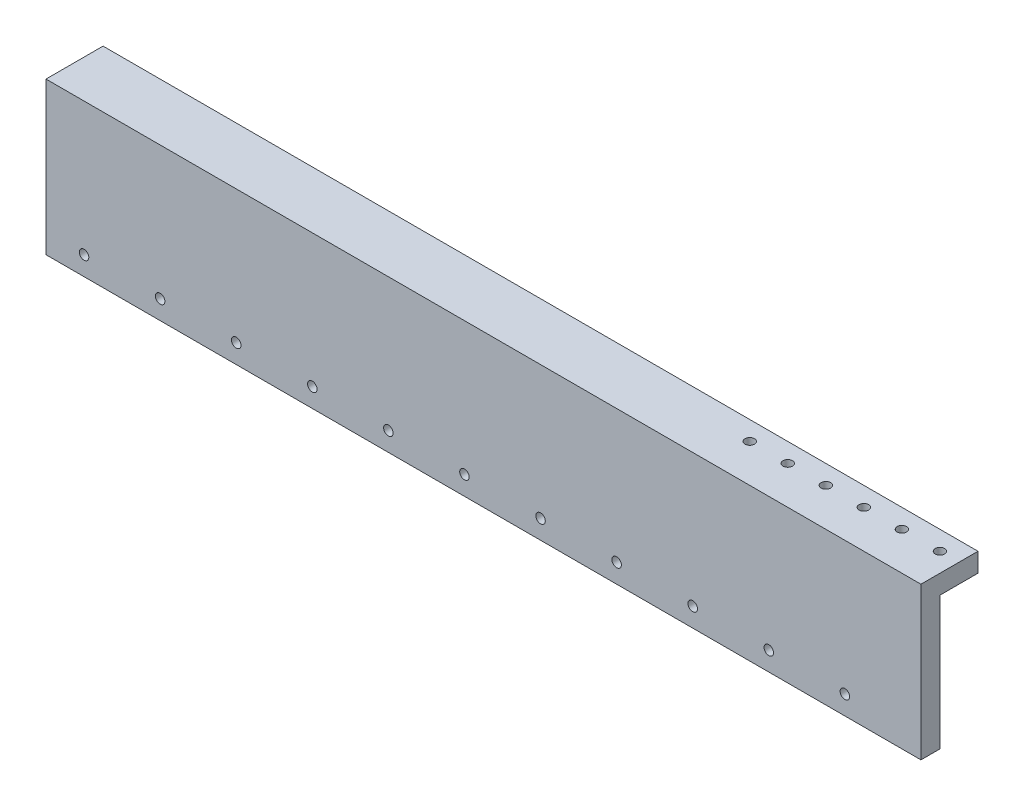
ISO-10303-21;
HEADER;
FILE_DESCRIPTION(('STEP AP214'),'2;1');
FILE_NAME('part.step','',(''),(''),'','','');
FILE_SCHEMA(('AUTOMOTIVE_DESIGN { 1 0 10303 214 1 1 1 1 }'));
ENDSEC;
DATA;
#1=APPLICATION_CONTEXT('core data for automotive mechanical design processes');
#2=APPLICATION_PROTOCOL_DEFINITION('international standard','automotive_design',2000,#1);
#3=PRODUCT_CONTEXT('',#1,'mechanical');
#4=PRODUCT('Part','Part','',(#3));
#5=PRODUCT_RELATED_PRODUCT_CATEGORY('part','',(#4));
#6=PRODUCT_DEFINITION_FORMATION('','',#4);
#7=PRODUCT_DEFINITION_CONTEXT('part definition',#1,'design');
#8=PRODUCT_DEFINITION('design','',#6,#7);
#9=PRODUCT_DEFINITION_SHAPE('','',#8);
#10=(LENGTH_UNIT() NAMED_UNIT(*) SI_UNIT(.MILLI.,.METRE.));
#11=(NAMED_UNIT(*) PLANE_ANGLE_UNIT() SI_UNIT($,.RADIAN.));
#12=(NAMED_UNIT(*) SI_UNIT($,.STERADIAN.) SOLID_ANGLE_UNIT());
#13=UNCERTAINTY_MEASURE_WITH_UNIT(LENGTH_MEASURE(1.E-05),#10,'distance_accuracy_value','');
#14=(GEOMETRIC_REPRESENTATION_CONTEXT(3) GLOBAL_UNCERTAINTY_ASSIGNED_CONTEXT((#13)) GLOBAL_UNIT_ASSIGNED_CONTEXT((#10,
#11,#12)) REPRESENTATION_CONTEXT('',''));
#15=CARTESIAN_POINT('',(0.,0.,0.));
#16=DIRECTION('',(0.,0.,1.));
#17=DIRECTION('',(1.,0.,0.));
#18=AXIS2_PLACEMENT_3D('',#15,#16,#17);
#19=CARTESIAN_POINT('',(0.,0.,-5.));
#20=DIRECTION('',(0.,0.,1.));
#21=DIRECTION('',(-1.,0.,0.));
#22=AXIS2_PLACEMENT_3D('',#19,#20,#21);
#23=PLANE('',#22);
#24=CARTESIAN_POINT('',(95.,-15.,-5.));
#25=DIRECTION('',(0.,0.,1.));
#26=DIRECTION('',(1.,0.,0.));
#27=AXIS2_PLACEMENT_3D('',#24,#25,#26);
#28=CIRCLE('',#27,1.25);
#29=CARTESIAN_POINT('',(96.25,-15.,-5.));
#30=VERTEX_POINT('',#29);
#31=EDGE_CURVE('E181',#30,#30,#28,.T.);
#32=ORIENTED_EDGE('',*,*,#31,.T.);
#33=EDGE_LOOP('',(#32));
#34=FACE_BOUND('',#33,.T.);
#35=CARTESIAN_POINT('',(75.,-15.,-5.));
#36=DIRECTION('',(0.,0.,1.));
#37=DIRECTION('',(1.,0.,0.));
#38=AXIS2_PLACEMENT_3D('',#35,#36,#37);
#39=CIRCLE('',#38,1.25);
#40=CARTESIAN_POINT('',(76.25,-15.,-5.));
#41=VERTEX_POINT('',#40);
#42=EDGE_CURVE('E175',#41,#41,#39,.T.);
#43=ORIENTED_EDGE('',*,*,#42,.T.);
#44=EDGE_LOOP('',(#43));
#45=FACE_BOUND('',#44,.T.);
#46=CARTESIAN_POINT('',(55.,-15.,-5.));
#47=DIRECTION('',(0.,0.,1.));
#48=DIRECTION('',(1.,0.,0.));
#49=AXIS2_PLACEMENT_3D('',#46,#47,#48);
#50=CIRCLE('',#49,1.25);
#51=CARTESIAN_POINT('',(56.25,-15.,-5.));
#52=VERTEX_POINT('',#51);
#53=EDGE_CURVE('E169',#52,#52,#50,.T.);
#54=ORIENTED_EDGE('',*,*,#53,.T.);
#55=EDGE_LOOP('',(#54));
#56=FACE_BOUND('',#55,.T.);
#57=CARTESIAN_POINT('',(35.,-15.,-5.));
#58=DIRECTION('',(0.,0.,1.));
#59=DIRECTION('',(1.,0.,0.));
#60=AXIS2_PLACEMENT_3D('',#57,#58,#59);
#61=CIRCLE('',#60,1.25);
#62=CARTESIAN_POINT('',(36.25,-15.,-5.));
#63=VERTEX_POINT('',#62);
#64=EDGE_CURVE('E163',#63,#63,#61,.T.);
#65=ORIENTED_EDGE('',*,*,#64,.T.);
#66=EDGE_LOOP('',(#65));
#67=FACE_BOUND('',#66,.T.);
#68=CARTESIAN_POINT('',(15.,-15.,-5.));
#69=DIRECTION('',(0.,0.,1.));
#70=DIRECTION('',(1.,0.,0.));
#71=AXIS2_PLACEMENT_3D('',#68,#69,#70);
#72=CIRCLE('',#71,1.25);
#73=CARTESIAN_POINT('',(16.25,-15.,-5.));
#74=VERTEX_POINT('',#73);
#75=EDGE_CURVE('E157',#74,#74,#72,.T.);
#76=ORIENTED_EDGE('',*,*,#75,.T.);
#77=EDGE_LOOP('',(#76));
#78=FACE_BOUND('',#77,.T.);
#79=CARTESIAN_POINT('',(-4.99999999999999,-15.,-5.));
#80=DIRECTION('',(0.,0.,1.));
#81=DIRECTION('',(1.,0.,0.));
#82=AXIS2_PLACEMENT_3D('',#79,#80,#81);
#83=CIRCLE('',#82,1.25);
#84=CARTESIAN_POINT('',(-3.74999999999999,-15.,-5.));
#85=VERTEX_POINT('',#84);
#86=EDGE_CURVE('E151',#85,#85,#83,.T.);
#87=ORIENTED_EDGE('',*,*,#86,.T.);
#88=EDGE_LOOP('',(#87));
#89=FACE_BOUND('',#88,.T.);
#90=CARTESIAN_POINT('',(-25.,-15.,-5.));
#91=DIRECTION('',(0.,0.,1.));
#92=DIRECTION('',(1.,0.,0.));
#93=AXIS2_PLACEMENT_3D('',#90,#91,#92);
#94=CIRCLE('',#93,1.25);
#95=CARTESIAN_POINT('',(-23.75,-15.,-5.));
#96=VERTEX_POINT('',#95);
#97=EDGE_CURVE('E145',#96,#96,#94,.T.);
#98=ORIENTED_EDGE('',*,*,#97,.T.);
#99=EDGE_LOOP('',(#98));
#100=FACE_BOUND('',#99,.T.);
#101=CARTESIAN_POINT('',(-45.,-15.,-5.));
#102=DIRECTION('',(0.,0.,1.));
#103=DIRECTION('',(1.,0.,0.));
#104=AXIS2_PLACEMENT_3D('',#101,#102,#103);
#105=CIRCLE('',#104,1.25);
#106=CARTESIAN_POINT('',(-43.75,-15.,-5.));
#107=VERTEX_POINT('',#106);
#108=EDGE_CURVE('E139',#107,#107,#105,.T.);
#109=ORIENTED_EDGE('',*,*,#108,.T.);
#110=EDGE_LOOP('',(#109));
#111=FACE_BOUND('',#110,.T.);
#112=CARTESIAN_POINT('',(-65.,-15.,-5.));
#113=DIRECTION('',(0.,0.,1.));
#114=DIRECTION('',(1.,0.,0.));
#115=AXIS2_PLACEMENT_3D('',#112,#113,#114);
#116=CIRCLE('',#115,1.25000000000001);
#117=CARTESIAN_POINT('',(-63.75,-15.,-5.));
#118=VERTEX_POINT('',#117);
#119=EDGE_CURVE('E133',#118,#118,#116,.T.);
#120=ORIENTED_EDGE('',*,*,#119,.T.);
#121=EDGE_LOOP('',(#120));
#122=FACE_BOUND('',#121,.T.);
#123=CARTESIAN_POINT('',(-85.,-15.,-5.));
#124=DIRECTION('',(0.,0.,1.));
#125=DIRECTION('',(1.,0.,0.));
#126=AXIS2_PLACEMENT_3D('',#123,#124,#125);
#127=CIRCLE('',#126,1.25);
#128=CARTESIAN_POINT('',(-83.75,-15.,-5.));
#129=VERTEX_POINT('',#128);
#130=EDGE_CURVE('E128',#129,#129,#127,.T.);
#131=ORIENTED_EDGE('',*,*,#130,.T.);
#132=EDGE_LOOP('',(#131));
#133=FACE_BOUND('',#132,.T.);
#134=CARTESIAN_POINT('',(-105.,-15.,-5.));
#135=DIRECTION('',(0.,0.,1.));
#136=DIRECTION('',(1.,0.,0.));
#137=AXIS2_PLACEMENT_3D('',#134,#135,#136);
#138=CIRCLE('',#137,1.25);
#139=CARTESIAN_POINT('',(-103.75,-15.,-5.));
#140=VERTEX_POINT('',#139);
#141=EDGE_CURVE('E101',#140,#140,#138,.T.);
#142=ORIENTED_EDGE('',*,*,#141,.T.);
#143=EDGE_LOOP('',(#142));
#144=FACE_BOUND('',#143,.T.);
#145=DIRECTION('',(1.,0.,0.));
#146=VECTOR('',#145,1.);
#147=CARTESIAN_POINT('',(-115.,15.,-5.));
#148=LINE('',#147,#146);
#149=CARTESIAN_POINT('',(-115.,15.,-5.));
#150=VERTEX_POINT('',#149);
#151=CARTESIAN_POINT('',(115.,15.,-5.));
#152=VERTEX_POINT('',#151);
#153=EDGE_CURVE('E123',#150,#152,#148,.T.);
#154=ORIENTED_EDGE('',*,*,#153,.T.);
#155=DIRECTION('',(0.,1.,0.));
#156=VECTOR('',#155,1.);
#157=CARTESIAN_POINT('',(115.,-20.,-5.));
#158=LINE('',#157,#156);
#159=CARTESIAN_POINT('',(115.,-20.,-5.));
#160=VERTEX_POINT('',#159);
#161=EDGE_CURVE('E95',#160,#152,#158,.T.);
#162=ORIENTED_EDGE('',*,*,#161,.F.);
#163=DIRECTION('',(1.,0.,0.));
#164=VECTOR('',#163,1.);
#165=CARTESIAN_POINT('',(-115.,-20.,-5.));
#166=LINE('',#165,#164);
#167=CARTESIAN_POINT('',(-115.,-20.,-5.));
#168=VERTEX_POINT('',#167);
#169=EDGE_CURVE('E83',#168,#160,#166,.T.);
#170=ORIENTED_EDGE('',*,*,#169,.F.);
#171=DIRECTION('',(0.,-1.,0.));
#172=VECTOR('',#171,1.);
#173=CARTESIAN_POINT('',(-115.,-20.,-5.));
#174=LINE('',#173,#172);
#175=EDGE_CURVE('E118',#150,#168,#174,.T.);
#176=ORIENTED_EDGE('',*,*,#175,.F.);
#177=EDGE_LOOP('',(#154,#162,#170,#176));
#178=FACE_BOUND('',#177,.T.);
#179=ADVANCED_FACE('F37',(#34,#45,#56,#67,#78,#89,#100,#111,#122,#133,#144,#178),#23,.F.);
#180=CARTESIAN_POINT('',(0.,0.,0.));
#181=DIRECTION('',(0.,0.,1.));
#182=DIRECTION('',(-1.,0.,0.));
#183=AXIS2_PLACEMENT_3D('',#180,#181,#182);
#184=PLANE('',#183);
#185=CARTESIAN_POINT('',(75.,-15.,0.));
#186=DIRECTION('',(0.,0.,1.));
#187=DIRECTION('',(1.,0.,0.));
#188=AXIS2_PLACEMENT_3D('',#185,#186,#187);
#189=CIRCLE('',#188,1.25);
#190=CARTESIAN_POINT('',(76.25,-15.,0.));
#191=VERTEX_POINT('',#190);
#192=EDGE_CURVE('E178',#191,#191,#189,.T.);
#193=ORIENTED_EDGE('',*,*,#192,.F.);
#194=EDGE_LOOP('',(#193));
#195=FACE_BOUND('',#194,.T.);
#196=CARTESIAN_POINT('',(35.,-15.,0.));
#197=DIRECTION('',(0.,0.,1.));
#198=DIRECTION('',(1.,0.,0.));
#199=AXIS2_PLACEMENT_3D('',#196,#197,#198);
#200=CIRCLE('',#199,1.25);
#201=CARTESIAN_POINT('',(36.25,-15.,0.));
#202=VERTEX_POINT('',#201);
#203=EDGE_CURVE('E166',#202,#202,#200,.T.);
#204=ORIENTED_EDGE('',*,*,#203,.F.);
#205=EDGE_LOOP('',(#204));
#206=FACE_BOUND('',#205,.T.);
#207=CARTESIAN_POINT('',(-4.99999999999999,-15.,0.));
#208=DIRECTION('',(0.,0.,1.));
#209=DIRECTION('',(1.,0.,0.));
#210=AXIS2_PLACEMENT_3D('',#207,#208,#209);
#211=CIRCLE('',#210,1.25);
#212=CARTESIAN_POINT('',(-3.74999999999999,-15.,0.));
#213=VERTEX_POINT('',#212);
#214=EDGE_CURVE('E154',#213,#213,#211,.T.);
#215=ORIENTED_EDGE('',*,*,#214,.F.);
#216=EDGE_LOOP('',(#215));
#217=FACE_BOUND('',#216,.T.);
#218=CARTESIAN_POINT('',(-45.,-15.,0.));
#219=DIRECTION('',(0.,0.,1.));
#220=DIRECTION('',(1.,0.,0.));
#221=AXIS2_PLACEMENT_3D('',#218,#219,#220);
#222=CIRCLE('',#221,1.25);
#223=CARTESIAN_POINT('',(-43.75,-15.,0.));
#224=VERTEX_POINT('',#223);
#225=EDGE_CURVE('E142',#224,#224,#222,.T.);
#226=ORIENTED_EDGE('',*,*,#225,.F.);
#227=EDGE_LOOP('',(#226));
#228=FACE_BOUND('',#227,.T.);
#229=CARTESIAN_POINT('',(-85.,-15.,0.));
#230=DIRECTION('',(0.,0.,1.));
#231=DIRECTION('',(1.,0.,0.));
#232=AXIS2_PLACEMENT_3D('',#229,#230,#231);
#233=CIRCLE('',#232,1.25);
#234=CARTESIAN_POINT('',(-83.75,-15.,0.));
#235=VERTEX_POINT('',#234);
#236=EDGE_CURVE('E130',#235,#235,#233,.T.);
#237=ORIENTED_EDGE('',*,*,#236,.F.);
#238=EDGE_LOOP('',(#237));
#239=FACE_BOUND('',#238,.T.);
#240=DIRECTION('',(0.,1.,0.));
#241=VECTOR('',#240,1.);
#242=CARTESIAN_POINT('',(115.,-20.,0.));
#243=LINE('',#242,#241);
#244=CARTESIAN_POINT('',(115.,-20.,0.));
#245=VERTEX_POINT('',#244);
#246=CARTESIAN_POINT('',(115.,20.,0.));
#247=VERTEX_POINT('',#246);
#248=EDGE_CURVE('E92',#245,#247,#243,.T.);
#249=ORIENTED_EDGE('',*,*,#248,.T.);
#250=DIRECTION('',(-1.,0.,0.));
#251=VECTOR('',#250,1.);
#252=CARTESIAN_POINT('',(-115.,20.,0.));
#253=LINE('',#252,#251);
#254=CARTESIAN_POINT('',(-115.,20.,0.));
#255=VERTEX_POINT('',#254);
#256=EDGE_CURVE('E100',#247,#255,#253,.T.);
#257=ORIENTED_EDGE('',*,*,#256,.T.);
#258=DIRECTION('',(0.,-1.,0.));
#259=VECTOR('',#258,1.);
#260=CARTESIAN_POINT('',(-115.,-20.,0.));
#261=LINE('',#260,#259);
#262=CARTESIAN_POINT('',(-115.,-20.,0.));
#263=VERTEX_POINT('',#262);
#264=EDGE_CURVE('E94',#255,#263,#261,.T.);
#265=ORIENTED_EDGE('',*,*,#264,.T.);
#266=DIRECTION('',(1.,0.,0.));
#267=VECTOR('',#266,1.);
#268=CARTESIAN_POINT('',(-115.,-20.,0.));
#269=LINE('',#268,#267);
#270=EDGE_CURVE('E80',#263,#245,#269,.T.);
#271=ORIENTED_EDGE('',*,*,#270,.T.);
#272=EDGE_LOOP('',(#249,#257,#265,#271));
#273=FACE_BOUND('',#272,.T.);
#274=CARTESIAN_POINT('',(-105.,-15.,0.));
#275=DIRECTION('',(0.,0.,1.));
#276=DIRECTION('',(1.,0.,0.));
#277=AXIS2_PLACEMENT_3D('',#274,#275,#276);
#278=CIRCLE('',#277,1.25);
#279=CARTESIAN_POINT('',(-103.75,-15.,0.));
#280=VERTEX_POINT('',#279);
#281=EDGE_CURVE('E105',#280,#280,#278,.T.);
#282=ORIENTED_EDGE('',*,*,#281,.F.);
#283=EDGE_LOOP('',(#282));
#284=FACE_BOUND('',#283,.T.);
#285=CARTESIAN_POINT('',(-65.,-15.,0.));
#286=DIRECTION('',(0.,0.,1.));
#287=DIRECTION('',(1.,0.,0.));
#288=AXIS2_PLACEMENT_3D('',#285,#286,#287);
#289=CIRCLE('',#288,1.25000000000001);
#290=CARTESIAN_POINT('',(-63.75,-15.,0.));
#291=VERTEX_POINT('',#290);
#292=EDGE_CURVE('E136',#291,#291,#289,.T.);
#293=ORIENTED_EDGE('',*,*,#292,.F.);
#294=EDGE_LOOP('',(#293));
#295=FACE_BOUND('',#294,.T.);
#296=CARTESIAN_POINT('',(-25.,-15.,0.));
#297=DIRECTION('',(0.,0.,1.));
#298=DIRECTION('',(1.,0.,0.));
#299=AXIS2_PLACEMENT_3D('',#296,#297,#298);
#300=CIRCLE('',#299,1.25);
#301=CARTESIAN_POINT('',(-23.75,-15.,0.));
#302=VERTEX_POINT('',#301);
#303=EDGE_CURVE('E148',#302,#302,#300,.T.);
#304=ORIENTED_EDGE('',*,*,#303,.F.);
#305=EDGE_LOOP('',(#304));
#306=FACE_BOUND('',#305,.T.);
#307=CARTESIAN_POINT('',(15.,-15.,0.));
#308=DIRECTION('',(0.,0.,1.));
#309=DIRECTION('',(1.,0.,0.));
#310=AXIS2_PLACEMENT_3D('',#307,#308,#309);
#311=CIRCLE('',#310,1.25);
#312=CARTESIAN_POINT('',(16.25,-15.,0.));
#313=VERTEX_POINT('',#312);
#314=EDGE_CURVE('E160',#313,#313,#311,.T.);
#315=ORIENTED_EDGE('',*,*,#314,.F.);
#316=EDGE_LOOP('',(#315));
#317=FACE_BOUND('',#316,.T.);
#318=CARTESIAN_POINT('',(55.,-15.,0.));
#319=DIRECTION('',(0.,0.,1.));
#320=DIRECTION('',(1.,0.,0.));
#321=AXIS2_PLACEMENT_3D('',#318,#319,#320);
#322=CIRCLE('',#321,1.25);
#323=CARTESIAN_POINT('',(56.25,-15.,0.));
#324=VERTEX_POINT('',#323);
#325=EDGE_CURVE('E172',#324,#324,#322,.T.);
#326=ORIENTED_EDGE('',*,*,#325,.F.);
#327=EDGE_LOOP('',(#326));
#328=FACE_BOUND('',#327,.T.);
#329=CARTESIAN_POINT('',(95.,-15.,0.));
#330=DIRECTION('',(0.,0.,1.));
#331=DIRECTION('',(1.,0.,0.));
#332=AXIS2_PLACEMENT_3D('',#329,#330,#331);
#333=CIRCLE('',#332,1.25);
#334=CARTESIAN_POINT('',(96.25,-15.,0.));
#335=VERTEX_POINT('',#334);
#336=EDGE_CURVE('E184',#335,#335,#333,.T.);
#337=ORIENTED_EDGE('',*,*,#336,.F.);
#338=EDGE_LOOP('',(#337));
#339=FACE_BOUND('',#338,.T.);
#340=ADVANCED_FACE('F89',(#195,#206,#217,#228,#239,#273,#284,#295,#306,#317,#328,#339),#184,.T.);
#341=CARTESIAN_POINT('',(115.,-20.,-5.));
#342=DIRECTION('',(-1.,0.,0.));
#343=DIRECTION('',(0.,0.,-1.));
#344=AXIS2_PLACEMENT_3D('',#341,#342,#343);
#345=PLANE('',#344);
#346=ORIENTED_EDGE('',*,*,#248,.F.);
#347=DIRECTION('',(0.,0.,1.));
#348=VECTOR('',#347,1.);
#349=CARTESIAN_POINT('',(115.,-20.,-5.));
#350=LINE('',#349,#348);
#351=EDGE_CURVE('E61',#160,#245,#350,.T.);
#352=ORIENTED_EDGE('',*,*,#351,.F.);
#353=ORIENTED_EDGE('',*,*,#161,.T.);
#354=DIRECTION('',(0.,0.,1.));
#355=VECTOR('',#354,1.);
#356=CARTESIAN_POINT('',(115.,15.,-15.));
#357=LINE('',#356,#355);
#358=CARTESIAN_POINT('',(115.,15.,-15.));
#359=VERTEX_POINT('',#358);
#360=EDGE_CURVE('E190',#359,#152,#357,.T.);
#361=ORIENTED_EDGE('',*,*,#360,.F.);
#362=DIRECTION('',(0.,1.,0.));
#363=VECTOR('',#362,1.);
#364=CARTESIAN_POINT('',(115.,20.,-15.));
#365=LINE('',#364,#363);
#366=CARTESIAN_POINT('',(115.,20.,-15.));
#367=VERTEX_POINT('',#366);
#368=EDGE_CURVE('E197',#359,#367,#365,.T.);
#369=ORIENTED_EDGE('',*,*,#368,.T.);
#370=DIRECTION('',(0.,0.,1.));
#371=VECTOR('',#370,1.);
#372=CARTESIAN_POINT('',(115.,20.,-5.));
#373=LINE('',#372,#371);
#374=EDGE_CURVE('E11',#367,#247,#373,.T.);
#375=ORIENTED_EDGE('',*,*,#374,.T.);
#376=EDGE_LOOP('',(#346,#352,#353,#361,#369,#375));
#377=FACE_BOUND('',#376,.T.);
#378=ADVANCED_FACE('F39',(#377),#345,.F.);
#379=CARTESIAN_POINT('',(-115.,20.,-5.));
#380=DIRECTION('',(0.,-1.,0.));
#381=DIRECTION('',(0.,0.,1.));
#382=AXIS2_PLACEMENT_3D('',#379,#380,#381);
#383=PLANE('',#382);
#384=CARTESIAN_POINT('',(110.,20.,-10.));
#385=DIRECTION('',(0.,-1.,0.));
#386=DIRECTION('',(0.,0.,-1.));
#387=AXIS2_PLACEMENT_3D('',#384,#385,#386);
#388=CIRCLE('',#387,1.25);
#389=CARTESIAN_POINT('',(110.,20.,-11.25));
#390=VERTEX_POINT('',#389);
#391=EDGE_CURVE('E231',#390,#390,#388,.T.);
#392=ORIENTED_EDGE('',*,*,#391,.T.);
#393=EDGE_LOOP('',(#392));
#394=FACE_BOUND('',#393,.T.);
#395=CARTESIAN_POINT('',(100.,20.,-10.0000000000001));
#396=DIRECTION('',(0.,-1.,0.));
#397=DIRECTION('',(0.,0.,-1.));
#398=AXIS2_PLACEMENT_3D('',#395,#396,#397);
#399=CIRCLE('',#398,1.25);
#400=CARTESIAN_POINT('',(100.,20.,-11.2500000000001));
#401=VERTEX_POINT('',#400);
#402=EDGE_CURVE('E225',#401,#401,#399,.T.);
#403=ORIENTED_EDGE('',*,*,#402,.T.);
#404=EDGE_LOOP('',(#403));
#405=FACE_BOUND('',#404,.T.);
#406=CARTESIAN_POINT('',(90.,20.,-10.0000000000001));
#407=DIRECTION('',(0.,-1.,0.));
#408=DIRECTION('',(0.,0.,-1.));
#409=AXIS2_PLACEMENT_3D('',#406,#407,#408);
#410=CIRCLE('',#409,1.25);
#411=CARTESIAN_POINT('',(90.,20.,-11.2500000000001));
#412=VERTEX_POINT('',#411);
#413=EDGE_CURVE('E219',#412,#412,#410,.T.);
#414=ORIENTED_EDGE('',*,*,#413,.T.);
#415=EDGE_LOOP('',(#414));
#416=FACE_BOUND('',#415,.T.);
#417=CARTESIAN_POINT('',(80.,20.,-10.0000000000002));
#418=DIRECTION('',(0.,-1.,0.));
#419=DIRECTION('',(0.,0.,-1.));
#420=AXIS2_PLACEMENT_3D('',#417,#418,#419);
#421=CIRCLE('',#420,1.25);
#422=CARTESIAN_POINT('',(80.,20.,-11.2500000000002));
#423=VERTEX_POINT('',#422);
#424=EDGE_CURVE('E213',#423,#423,#421,.T.);
#425=ORIENTED_EDGE('',*,*,#424,.T.);
#426=EDGE_LOOP('',(#425));
#427=FACE_BOUND('',#426,.T.);
#428=CARTESIAN_POINT('',(70.,20.,-10.0000000000003));
#429=DIRECTION('',(0.,-1.,0.));
#430=DIRECTION('',(0.,0.,-1.));
#431=AXIS2_PLACEMENT_3D('',#428,#429,#430);
#432=CIRCLE('',#431,1.25000000000001);
#433=CARTESIAN_POINT('',(70.,20.,-11.2500000000003));
#434=VERTEX_POINT('',#433);
#435=EDGE_CURVE('E206',#434,#434,#432,.T.);
#436=ORIENTED_EDGE('',*,*,#435,.T.);
#437=EDGE_LOOP('',(#436));
#438=FACE_BOUND('',#437,.T.);
#439=CARTESIAN_POINT('',(60.,20.,-10.0000000000003));
#440=DIRECTION('',(0.,-1.,0.));
#441=DIRECTION('',(0.,0.,-1.));
#442=AXIS2_PLACEMENT_3D('',#439,#440,#441);
#443=CIRCLE('',#442,1.25);
#444=CARTESIAN_POINT('',(60.,20.,-11.2500000000003));
#445=VERTEX_POINT('',#444);
#446=EDGE_CURVE('E207',#445,#445,#443,.T.);
#447=ORIENTED_EDGE('',*,*,#446,.T.);
#448=EDGE_LOOP('',(#447));
#449=FACE_BOUND('',#448,.T.);
#450=ORIENTED_EDGE('',*,*,#256,.F.);
#451=ORIENTED_EDGE('',*,*,#374,.F.);
#452=DIRECTION('',(-1.,0.,0.));
#453=VECTOR('',#452,1.);
#454=CARTESIAN_POINT('',(-115.,20.,-15.));
#455=LINE('',#454,#453);
#456=CARTESIAN_POINT('',(-115.,20.,-15.));
#457=VERTEX_POINT('',#456);
#458=EDGE_CURVE('E116',#367,#457,#455,.T.);
#459=ORIENTED_EDGE('',*,*,#458,.T.);
#460=DIRECTION('',(0.,0.,1.));
#461=VECTOR('',#460,1.);
#462=CARTESIAN_POINT('',(-115.,20.,-5.));
#463=LINE('',#462,#461);
#464=EDGE_CURVE('E45',#457,#255,#463,.T.);
#465=ORIENTED_EDGE('',*,*,#464,.T.);
#466=EDGE_LOOP('',(#450,#451,#459,#465));
#467=FACE_BOUND('',#466,.T.);
#468=ADVANCED_FACE('F114',(#394,#405,#416,#427,#438,#449,#467),#383,.F.);
#469=CARTESIAN_POINT('',(-115.,-20.,-5.));
#470=DIRECTION('',(1.,0.,0.));
#471=DIRECTION('',(0.,0.,1.));
#472=AXIS2_PLACEMENT_3D('',#469,#470,#471);
#473=PLANE('',#472);
#474=ORIENTED_EDGE('',*,*,#264,.F.);
#475=ORIENTED_EDGE('',*,*,#464,.F.);
#476=DIRECTION('',(0.,-1.,0.));
#477=VECTOR('',#476,1.);
#478=CARTESIAN_POINT('',(-115.,20.,-15.));
#479=LINE('',#478,#477);
#480=CARTESIAN_POINT('',(-115.,15.,-15.));
#481=VERTEX_POINT('',#480);
#482=EDGE_CURVE('E194',#457,#481,#479,.T.);
#483=ORIENTED_EDGE('',*,*,#482,.T.);
#484=DIRECTION('',(0.,0.,1.));
#485=VECTOR('',#484,1.);
#486=CARTESIAN_POINT('',(-115.,15.,-15.));
#487=LINE('',#486,#485);
#488=EDGE_CURVE('E52',#481,#150,#487,.T.);
#489=ORIENTED_EDGE('',*,*,#488,.T.);
#490=ORIENTED_EDGE('',*,*,#175,.T.);
#491=DIRECTION('',(0.,0.,1.));
#492=VECTOR('',#491,1.);
#493=CARTESIAN_POINT('',(-115.,-20.,-5.));
#494=LINE('',#493,#492);
#495=EDGE_CURVE('E85',#168,#263,#494,.T.);
#496=ORIENTED_EDGE('',*,*,#495,.T.);
#497=EDGE_LOOP('',(#474,#475,#483,#489,#490,#496));
#498=FACE_BOUND('',#497,.T.);
#499=ADVANCED_FACE('F117',(#498),#473,.F.);
#500=CARTESIAN_POINT('',(-115.,-20.,-5.));
#501=DIRECTION('',(0.,1.,0.));
#502=DIRECTION('',(0.,0.,-1.));
#503=AXIS2_PLACEMENT_3D('',#500,#501,#502);
#504=PLANE('',#503);
#505=ORIENTED_EDGE('',*,*,#270,.F.);
#506=ORIENTED_EDGE('',*,*,#495,.F.);
#507=ORIENTED_EDGE('',*,*,#169,.T.);
#508=ORIENTED_EDGE('',*,*,#351,.T.);
#509=EDGE_LOOP('',(#505,#506,#507,#508));
#510=FACE_BOUND('',#509,.T.);
#511=ADVANCED_FACE('F79',(#510),#504,.F.);
#512=CARTESIAN_POINT('',(-105.,-15.,-5.));
#513=DIRECTION('',(0.,0.,1.));
#514=DIRECTION('',(-1.,0.,0.));
#515=AXIS2_PLACEMENT_3D('',#512,#513,#514);
#516=CYLINDRICAL_SURFACE('',#515,1.25);
#517=ORIENTED_EDGE('',*,*,#141,.F.);
#518=EDGE_LOOP('',(#517));
#519=FACE_BOUND('',#518,.T.);
#520=ORIENTED_EDGE('',*,*,#281,.T.);
#521=EDGE_LOOP('',(#520));
#522=FACE_BOUND('',#521,.T.);
#523=ADVANCED_FACE('F294',(#519,#522),#516,.F.);
#524=CARTESIAN_POINT('',(-85.,-15.,-5.));
#525=DIRECTION('',(0.,0.,1.));
#526=DIRECTION('',(-1.,0.,0.));
#527=AXIS2_PLACEMENT_3D('',#524,#525,#526);
#528=CYLINDRICAL_SURFACE('',#527,1.25);
#529=ORIENTED_EDGE('',*,*,#130,.F.);
#530=EDGE_LOOP('',(#529));
#531=FACE_BOUND('',#530,.T.);
#532=ORIENTED_EDGE('',*,*,#236,.T.);
#533=EDGE_LOOP('',(#532));
#534=FACE_BOUND('',#533,.T.);
#535=ADVANCED_FACE('F349',(#531,#534),#528,.F.);
#536=CARTESIAN_POINT('',(-65.,-15.,-5.));
#537=DIRECTION('',(0.,0.,1.));
#538=DIRECTION('',(-1.,0.,0.));
#539=AXIS2_PLACEMENT_3D('',#536,#537,#538);
#540=CYLINDRICAL_SURFACE('',#539,1.25000000000001);
#541=ORIENTED_EDGE('',*,*,#119,.F.);
#542=EDGE_LOOP('',(#541));
#543=FACE_BOUND('',#542,.T.);
#544=ORIENTED_EDGE('',*,*,#292,.T.);
#545=EDGE_LOOP('',(#544));
#546=FACE_BOUND('',#545,.T.);
#547=ADVANCED_FACE('F357',(#543,#546),#540,.F.);
#548=CARTESIAN_POINT('',(-45.,-15.,-5.));
#549=DIRECTION('',(0.,0.,1.));
#550=DIRECTION('',(-1.,0.,0.));
#551=AXIS2_PLACEMENT_3D('',#548,#549,#550);
#552=CYLINDRICAL_SURFACE('',#551,1.25);
#553=ORIENTED_EDGE('',*,*,#108,.F.);
#554=EDGE_LOOP('',(#553));
#555=FACE_BOUND('',#554,.T.);
#556=ORIENTED_EDGE('',*,*,#225,.T.);
#557=EDGE_LOOP('',(#556));
#558=FACE_BOUND('',#557,.T.);
#559=ADVANCED_FACE('F365',(#555,#558),#552,.F.);
#560=CARTESIAN_POINT('',(-25.,-15.,-5.));
#561=DIRECTION('',(0.,0.,1.));
#562=DIRECTION('',(-1.,0.,0.));
#563=AXIS2_PLACEMENT_3D('',#560,#561,#562);
#564=CYLINDRICAL_SURFACE('',#563,1.25);
#565=ORIENTED_EDGE('',*,*,#97,.F.);
#566=EDGE_LOOP('',(#565));
#567=FACE_BOUND('',#566,.T.);
#568=ORIENTED_EDGE('',*,*,#303,.T.);
#569=EDGE_LOOP('',(#568));
#570=FACE_BOUND('',#569,.T.);
#571=ADVANCED_FACE('F374',(#567,#570),#564,.F.);
#572=CARTESIAN_POINT('',(-4.99999999999999,-15.,-5.));
#573=DIRECTION('',(0.,0.,1.));
#574=DIRECTION('',(-1.,0.,0.));
#575=AXIS2_PLACEMENT_3D('',#572,#573,#574);
#576=CYLINDRICAL_SURFACE('',#575,1.25);
#577=ORIENTED_EDGE('',*,*,#86,.F.);
#578=EDGE_LOOP('',(#577));
#579=FACE_BOUND('',#578,.T.);
#580=ORIENTED_EDGE('',*,*,#214,.T.);
#581=EDGE_LOOP('',(#580));
#582=FACE_BOUND('',#581,.T.);
#583=ADVANCED_FACE('F383',(#579,#582),#576,.F.);
#584=CARTESIAN_POINT('',(15.,-15.,-5.));
#585=DIRECTION('',(0.,0.,1.));
#586=DIRECTION('',(-1.,0.,0.));
#587=AXIS2_PLACEMENT_3D('',#584,#585,#586);
#588=CYLINDRICAL_SURFACE('',#587,1.25);
#589=ORIENTED_EDGE('',*,*,#75,.F.);
#590=EDGE_LOOP('',(#589));
#591=FACE_BOUND('',#590,.T.);
#592=ORIENTED_EDGE('',*,*,#314,.T.);
#593=EDGE_LOOP('',(#592));
#594=FACE_BOUND('',#593,.T.);
#595=ADVANCED_FACE('F392',(#591,#594),#588,.F.);
#596=CARTESIAN_POINT('',(35.,-15.,-5.));
#597=DIRECTION('',(0.,0.,1.));
#598=DIRECTION('',(-1.,0.,0.));
#599=AXIS2_PLACEMENT_3D('',#596,#597,#598);
#600=CYLINDRICAL_SURFACE('',#599,1.25);
#601=ORIENTED_EDGE('',*,*,#64,.F.);
#602=EDGE_LOOP('',(#601));
#603=FACE_BOUND('',#602,.T.);
#604=ORIENTED_EDGE('',*,*,#203,.T.);
#605=EDGE_LOOP('',(#604));
#606=FACE_BOUND('',#605,.T.);
#607=ADVANCED_FACE('F401',(#603,#606),#600,.F.);
#608=CARTESIAN_POINT('',(55.,-15.,-5.));
#609=DIRECTION('',(0.,0.,1.));
#610=DIRECTION('',(-1.,0.,0.));
#611=AXIS2_PLACEMENT_3D('',#608,#609,#610);
#612=CYLINDRICAL_SURFACE('',#611,1.25);
#613=ORIENTED_EDGE('',*,*,#53,.F.);
#614=EDGE_LOOP('',(#613));
#615=FACE_BOUND('',#614,.T.);
#616=ORIENTED_EDGE('',*,*,#325,.T.);
#617=EDGE_LOOP('',(#616));
#618=FACE_BOUND('',#617,.T.);
#619=ADVANCED_FACE('F410',(#615,#618),#612,.F.);
#620=CARTESIAN_POINT('',(75.,-15.,-5.));
#621=DIRECTION('',(0.,0.,1.));
#622=DIRECTION('',(-1.,0.,0.));
#623=AXIS2_PLACEMENT_3D('',#620,#621,#622);
#624=CYLINDRICAL_SURFACE('',#623,1.25);
#625=ORIENTED_EDGE('',*,*,#42,.F.);
#626=EDGE_LOOP('',(#625));
#627=FACE_BOUND('',#626,.T.);
#628=ORIENTED_EDGE('',*,*,#192,.T.);
#629=EDGE_LOOP('',(#628));
#630=FACE_BOUND('',#629,.T.);
#631=ADVANCED_FACE('F419',(#627,#630),#624,.F.);
#632=CARTESIAN_POINT('',(95.,-15.,-5.));
#633=DIRECTION('',(0.,0.,1.));
#634=DIRECTION('',(-1.,0.,0.));
#635=AXIS2_PLACEMENT_3D('',#632,#633,#634);
#636=CYLINDRICAL_SURFACE('',#635,1.25);
#637=ORIENTED_EDGE('',*,*,#31,.F.);
#638=EDGE_LOOP('',(#637));
#639=FACE_BOUND('',#638,.T.);
#640=ORIENTED_EDGE('',*,*,#336,.T.);
#641=EDGE_LOOP('',(#640));
#642=FACE_BOUND('',#641,.T.);
#643=ADVANCED_FACE('F252',(#639,#642),#636,.F.);
#644=CARTESIAN_POINT('',(-115.,15.,-15.));
#645=DIRECTION('',(0.,1.,0.));
#646=DIRECTION('',(-1.,0.,0.));
#647=AXIS2_PLACEMENT_3D('',#644,#645,#646);
#648=PLANE('',#647);
#649=CARTESIAN_POINT('',(110.,15.,-10.));
#650=DIRECTION('',(0.,-1.,0.));
#651=DIRECTION('',(-1.,0.,0.));
#652=AXIS2_PLACEMENT_3D('',#649,#650,#651);
#653=CIRCLE('',#652,1.25);
#654=CARTESIAN_POINT('',(108.75,15.,-10.));
#655=VERTEX_POINT('',#654);
#656=EDGE_CURVE('E195',#655,#655,#653,.F.);
#657=ORIENTED_EDGE('',*,*,#656,.T.);
#658=EDGE_LOOP('',(#657));
#659=FACE_BOUND('',#658,.T.);
#660=CARTESIAN_POINT('',(100.,15.,-10.0000000000001));
#661=DIRECTION('',(0.,-1.,0.));
#662=DIRECTION('',(-1.,0.,0.));
#663=AXIS2_PLACEMENT_3D('',#660,#661,#662);
#664=CIRCLE('',#663,1.25);
#665=CARTESIAN_POINT('',(98.75,15.,-10.0000000000001));
#666=VERTEX_POINT('',#665);
#667=EDGE_CURVE('E228',#666,#666,#664,.F.);
#668=ORIENTED_EDGE('',*,*,#667,.T.);
#669=EDGE_LOOP('',(#668));
#670=FACE_BOUND('',#669,.T.);
#671=CARTESIAN_POINT('',(90.,15.,-10.0000000000001));
#672=DIRECTION('',(0.,-1.,0.));
#673=DIRECTION('',(-1.,0.,0.));
#674=AXIS2_PLACEMENT_3D('',#671,#672,#673);
#675=CIRCLE('',#674,1.25);
#676=CARTESIAN_POINT('',(88.75,15.,-10.0000000000001));
#677=VERTEX_POINT('',#676);
#678=EDGE_CURVE('E222',#677,#677,#675,.F.);
#679=ORIENTED_EDGE('',*,*,#678,.T.);
#680=EDGE_LOOP('',(#679));
#681=FACE_BOUND('',#680,.T.);
#682=CARTESIAN_POINT('',(80.,15.,-10.0000000000002));
#683=DIRECTION('',(0.,-1.,0.));
#684=DIRECTION('',(-1.,0.,0.));
#685=AXIS2_PLACEMENT_3D('',#682,#683,#684);
#686=CIRCLE('',#685,1.25);
#687=CARTESIAN_POINT('',(78.75,15.,-10.0000000000002));
#688=VERTEX_POINT('',#687);
#689=EDGE_CURVE('E216',#688,#688,#686,.F.);
#690=ORIENTED_EDGE('',*,*,#689,.T.);
#691=EDGE_LOOP('',(#690));
#692=FACE_BOUND('',#691,.T.);
#693=CARTESIAN_POINT('',(70.,15.,-10.0000000000003));
#694=DIRECTION('',(0.,-1.,0.));
#695=DIRECTION('',(-1.,0.,0.));
#696=AXIS2_PLACEMENT_3D('',#693,#694,#695);
#697=CIRCLE('',#696,1.25000000000001);
#698=CARTESIAN_POINT('',(68.75,15.,-10.0000000000003));
#699=VERTEX_POINT('',#698);
#700=EDGE_CURVE('E210',#699,#699,#697,.F.);
#701=ORIENTED_EDGE('',*,*,#700,.T.);
#702=EDGE_LOOP('',(#701));
#703=FACE_BOUND('',#702,.T.);
#704=CARTESIAN_POINT('',(60.,15.,-10.0000000000003));
#705=DIRECTION('',(0.,-1.,0.));
#706=DIRECTION('',(-1.,0.,0.));
#707=AXIS2_PLACEMENT_3D('',#704,#705,#706);
#708=CIRCLE('',#707,1.25);
#709=CARTESIAN_POINT('',(58.75,15.,-10.0000000000003));
#710=VERTEX_POINT('',#709);
#711=EDGE_CURVE('E203',#710,#710,#708,.F.);
#712=ORIENTED_EDGE('',*,*,#711,.T.);
#713=EDGE_LOOP('',(#712));
#714=FACE_BOUND('',#713,.T.);
#715=ORIENTED_EDGE('',*,*,#153,.F.);
#716=ORIENTED_EDGE('',*,*,#488,.F.);
#717=DIRECTION('',(1.,0.,0.));
#718=VECTOR('',#717,1.);
#719=CARTESIAN_POINT('',(-115.,15.,-15.));
#720=LINE('',#719,#718);
#721=EDGE_CURVE('E199',#481,#359,#720,.T.);
#722=ORIENTED_EDGE('',*,*,#721,.T.);
#723=ORIENTED_EDGE('',*,*,#360,.T.);
#724=EDGE_LOOP('',(#715,#716,#722,#723));
#725=FACE_BOUND('',#724,.T.);
#726=ADVANCED_FACE('F248',(#659,#670,#681,#692,#703,#714,#725),#648,.F.);
#727=CARTESIAN_POINT('',(0.,0.,-15.));
#728=DIRECTION('',(0.,0.,-1.));
#729=DIRECTION('',(1.,0.,0.));
#730=AXIS2_PLACEMENT_3D('',#727,#728,#729);
#731=PLANE('',#730);
#732=ORIENTED_EDGE('',*,*,#482,.F.);
#733=ORIENTED_EDGE('',*,*,#458,.F.);
#734=ORIENTED_EDGE('',*,*,#368,.F.);
#735=ORIENTED_EDGE('',*,*,#721,.F.);
#736=EDGE_LOOP('',(#732,#733,#734,#735));
#737=FACE_BOUND('',#736,.T.);
#738=ADVANCED_FACE('F251',(#737),#731,.T.);
#739=CARTESIAN_POINT('',(60.,-20.001,-10.0000000000003));
#740=DIRECTION('',(0.,1.,0.));
#741=DIRECTION('',(0.,0.,-1.));
#742=AXIS2_PLACEMENT_3D('',#739,#740,#741);
#743=CYLINDRICAL_SURFACE('',#742,1.25);
#744=ORIENTED_EDGE('',*,*,#446,.F.);
#745=EDGE_LOOP('',(#744));
#746=FACE_BOUND('',#745,.T.);
#747=ORIENTED_EDGE('',*,*,#711,.F.);
#748=EDGE_LOOP('',(#747));
#749=FACE_BOUND('',#748,.T.);
#750=ADVANCED_FACE('F276',(#746,#749),#743,.F.);
#751=CARTESIAN_POINT('',(70.,-20.001,-10.0000000000003));
#752=DIRECTION('',(0.,1.,0.));
#753=DIRECTION('',(0.,0.,-1.));
#754=AXIS2_PLACEMENT_3D('',#751,#752,#753);
#755=CYLINDRICAL_SURFACE('',#754,1.25000000000001);
#756=ORIENTED_EDGE('',*,*,#435,.F.);
#757=EDGE_LOOP('',(#756));
#758=FACE_BOUND('',#757,.T.);
#759=ORIENTED_EDGE('',*,*,#700,.F.);
#760=EDGE_LOOP('',(#759));
#761=FACE_BOUND('',#760,.T.);
#762=ADVANCED_FACE('F281',(#758,#761),#755,.F.);
#763=CARTESIAN_POINT('',(80.,-20.001,-10.0000000000002));
#764=DIRECTION('',(0.,1.,0.));
#765=DIRECTION('',(0.,0.,-1.));
#766=AXIS2_PLACEMENT_3D('',#763,#764,#765);
#767=CYLINDRICAL_SURFACE('',#766,1.25);
#768=ORIENTED_EDGE('',*,*,#424,.F.);
#769=EDGE_LOOP('',(#768));
#770=FACE_BOUND('',#769,.T.);
#771=ORIENTED_EDGE('',*,*,#689,.F.);
#772=EDGE_LOOP('',(#771));
#773=FACE_BOUND('',#772,.T.);
#774=ADVANCED_FACE('F458',(#770,#773),#767,.F.);
#775=CARTESIAN_POINT('',(90.,-20.001,-10.0000000000001));
#776=DIRECTION('',(0.,1.,0.));
#777=DIRECTION('',(0.,0.,-1.));
#778=AXIS2_PLACEMENT_3D('',#775,#776,#777);
#779=CYLINDRICAL_SURFACE('',#778,1.25);
#780=ORIENTED_EDGE('',*,*,#413,.F.);
#781=EDGE_LOOP('',(#780));
#782=FACE_BOUND('',#781,.T.);
#783=ORIENTED_EDGE('',*,*,#678,.F.);
#784=EDGE_LOOP('',(#783));
#785=FACE_BOUND('',#784,.T.);
#786=ADVANCED_FACE('F467',(#782,#785),#779,.F.);
#787=CARTESIAN_POINT('',(100.,-20.001,-10.0000000000001));
#788=DIRECTION('',(0.,1.,0.));
#789=DIRECTION('',(0.,0.,-1.));
#790=AXIS2_PLACEMENT_3D('',#787,#788,#789);
#791=CYLINDRICAL_SURFACE('',#790,1.25);
#792=ORIENTED_EDGE('',*,*,#402,.F.);
#793=EDGE_LOOP('',(#792));
#794=FACE_BOUND('',#793,.T.);
#795=ORIENTED_EDGE('',*,*,#667,.F.);
#796=EDGE_LOOP('',(#795));
#797=FACE_BOUND('',#796,.T.);
#798=ADVANCED_FACE('F244',(#794,#797),#791,.F.);
#799=CARTESIAN_POINT('',(110.,-20.001,-10.));
#800=DIRECTION('',(0.,1.,0.));
#801=DIRECTION('',(0.,0.,-1.));
#802=AXIS2_PLACEMENT_3D('',#799,#800,#801);
#803=CYLINDRICAL_SURFACE('',#802,1.25);
#804=ORIENTED_EDGE('',*,*,#391,.F.);
#805=EDGE_LOOP('',(#804));
#806=FACE_BOUND('',#805,.T.);
#807=ORIENTED_EDGE('',*,*,#656,.F.);
#808=EDGE_LOOP('',(#807));
#809=FACE_BOUND('',#808,.T.);
#810=ADVANCED_FACE('F241',(#806,#809),#803,.F.);
#811=CLOSED_SHELL('',(#179,#340,#378,#468,#499,#511,#523,#535,#547,#559,#571,#583,#595,#607,
#619,#631,#643,#726,#738,#750,#762,#774,#786,#798,#810));
#812=MANIFOLD_SOLID_BREP('B2',#811);
#813=ADVANCED_BREP_SHAPE_REPRESENTATION('',(#18,#812),#14);
#814=SHAPE_DEFINITION_REPRESENTATION(#9,#813);
ENDSEC;
END-ISO-10303-21;
